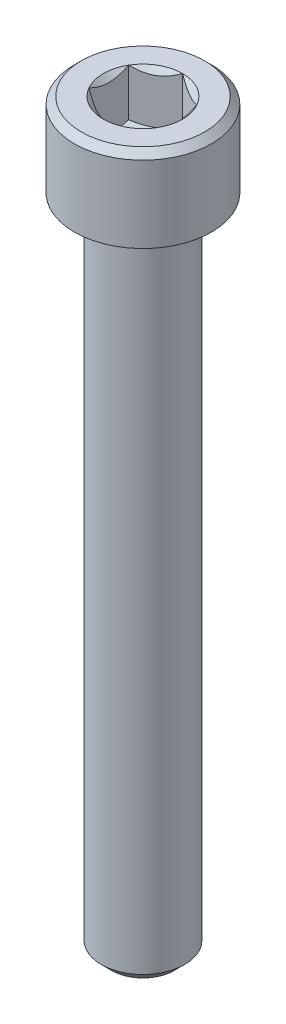
ISO-10303-21;
HEADER;
FILE_DESCRIPTION(('STEP AP214'),'2;1');
FILE_NAME('part.step','',(''),(''),'','','');
FILE_SCHEMA(('AUTOMOTIVE_DESIGN { 1 0 10303 214 1 1 1 1 }'));
ENDSEC;
DATA;
#1=APPLICATION_CONTEXT('core data for automotive mechanical design processes');
#2=APPLICATION_PROTOCOL_DEFINITION('international standard','automotive_design',2000,#1);
#3=PRODUCT_CONTEXT('',#1,'mechanical');
#4=PRODUCT('Part','Part','',(#3));
#5=PRODUCT_RELATED_PRODUCT_CATEGORY('part','',(#4));
#6=PRODUCT_DEFINITION_FORMATION('','',#4);
#7=PRODUCT_DEFINITION_CONTEXT('part definition',#1,'design');
#8=PRODUCT_DEFINITION('design','',#6,#7);
#9=PRODUCT_DEFINITION_SHAPE('','',#8);
#10=(LENGTH_UNIT() NAMED_UNIT(*) SI_UNIT(.MILLI.,.METRE.));
#11=(NAMED_UNIT(*) PLANE_ANGLE_UNIT() SI_UNIT($,.RADIAN.));
#12=(NAMED_UNIT(*) SI_UNIT($,.STERADIAN.) SOLID_ANGLE_UNIT());
#13=UNCERTAINTY_MEASURE_WITH_UNIT(LENGTH_MEASURE(1.E-05),#10,'distance_accuracy_value','');
#14=(GEOMETRIC_REPRESENTATION_CONTEXT(3) GLOBAL_UNCERTAINTY_ASSIGNED_CONTEXT((#13)) GLOBAL_UNIT_ASSIGNED_CONTEXT((#10,
#11,#12)) REPRESENTATION_CONTEXT('',''));
#15=CARTESIAN_POINT('',(0.,0.,0.));
#16=DIRECTION('',(0.,0.,1.));
#17=DIRECTION('',(1.,0.,0.));
#18=AXIS2_PLACEMENT_3D('',#15,#16,#17);
#19=CARTESIAN_POINT('',(0.,4.826,0.));
#20=DIRECTION('',(0.,1.,0.));
#21=DIRECTION('',(0.,0.,1.));
#22=AXIS2_PLACEMENT_3D('',#19,#20,#21);
#23=CONICAL_SURFACE('',#22,2.29135888084632,0.785398163397448);
#24=CARTESIAN_POINT('',(1.984575,4.82611547878185,1.14556397036933));
#25=CARTESIAN_POINT('',(1.9163590048332,4.78676285226392,1.18494849354192));
#26=CARTESIAN_POINT('',(1.84700231489304,4.74972131044619,1.22499159714897));
#27=CARTESIAN_POINT('',(1.70557619954781,4.68189885842333,1.30664400291398));
#28=CARTESIAN_POINT('',(1.63349332126322,4.65115568909176,1.34826107209555));
#29=CARTESIAN_POINT('',(1.488141602734,4.59849188881122,1.43217992591557));
#30=CARTESIAN_POINT('',(1.41490978751306,4.57643887587997,1.47446033414662));
#31=CARTESIAN_POINT('',(1.2668338174053,4.54246149294388,1.55995203534886));
#32=CARTESIAN_POINT('',(1.19199418724658,4.53051175609173,1.60316071596704));
#33=CARTESIAN_POINT('',(1.06301458545619,4.51973009908191,1.6776271237807));
#34=CARTESIAN_POINT('',(1.00904128422756,4.51813389905907,1.7087886237741));
#35=CARTESIAN_POINT('',(0.901182881480204,4.52082183886529,1.77106070163465));
#36=CARTESIAN_POINT('',(0.847297817514481,4.52510804034046,1.80217125782056));
#37=CARTESIAN_POINT('',(0.7400364617514,4.53931687301352,1.86409863044402));
#38=CARTESIAN_POINT('',(0.686660807239864,4.54924581045227,1.89491507894443));
#39=CARTESIAN_POINT('',(0.580832482591108,4.57419508427454,1.95601509066827));
#40=CARTESIAN_POINT('',(0.528379742028904,4.58921503038949,1.9862986945516));
#41=CARTESIAN_POINT('',(0.394017661036358,4.63380785163567,2.06387267818152));
#42=CARTESIAN_POINT('',(0.312941642841681,4.66674299593833,2.11068193911104));
#43=CARTESIAN_POINT('',(0.193726693270166,4.7223424412022,2.17951072233758));
#44=CARTESIAN_POINT('',(0.154440075614005,4.74187759205186,2.20219286161692));
#45=CARTESIAN_POINT('',(0.0765946381319537,4.7827287381194,2.24713694590236));
#46=CARTESIAN_POINT('',(0.0380353888983078,4.80404363956835,2.26939913882716));
#47=CARTESIAN_POINT('',(-0.000199999999994834,4.82611547878184,2.29147435090016));
#48=B_SPLINE_CURVE_WITH_KNOTS('',3,(#24,#25,#26,#27,#28,#29,#30,#31,#32,#33,#34,#35,#36,#37,#38,
#39,#40,#41,#42,#43,#44,#45,#46,#47),.UNSPECIFIED.,.F.,.F.,(4,2,2,2,2,2,2,2,2,2,2,4),(0.,
0.264339630306626,0.530219665093695,0.791876416371459,1.05287424418109,1.239639843932,
1.42647091743852,1.61351120244034,1.8005371524754,2.09764209964316,2.24579179873713,
2.39385111134156),.UNSPECIFIED.);
#49=CARTESIAN_POINT('',(1.984375,4.826,1.14567944042316));
#50=VERTEX_POINT('',#49);
#51=CARTESIAN_POINT('',(0.,4.826,2.29135888084632));
#52=VERTEX_POINT('',#51);
#53=EDGE_CURVE('E190',#50,#52,#48,.T.);
#54=ORIENTED_EDGE('',*,*,#53,.T.);
#55=CARTESIAN_POINT('',(0.,4.826,0.));
#56=DIRECTION('',(0.,1.,0.));
#57=DIRECTION('',(0.,0.,1.));
#58=AXIS2_PLACEMENT_3D('',#55,#56,#57);
#59=CIRCLE('',#58,2.29135888084632);
#60=EDGE_CURVE('E264',#52,#50,#59,.T.);
#61=ORIENTED_EDGE('',*,*,#60,.T.);
#62=EDGE_LOOP('',(#54,#61));
#63=FACE_BOUND('',#62,.T.);
#64=ADVANCED_FACE('F17',(#63),#23,.F.);
#65=CARTESIAN_POINT('',(-1.984375,4.826,1.14567944042317));
#66=VERTEX_POINT('',#65);
#67=EDGE_CURVE('E263',#66,#52,#59,.T.);
#68=ORIENTED_EDGE('',*,*,#67,.T.);
#69=CARTESIAN_POINT('',(0.00020000000000524,4.82611547878185,2.29147435090017));
#70=CARTESIAN_POINT('',(-0.0680159951667969,4.78676285226392,2.25208982772758));
#71=CARTESIAN_POINT('',(-0.13737268510696,4.74972131044619,2.21204672412052));
#72=CARTESIAN_POINT('',(-0.278798800452183,4.68189885842333,2.13039431835552));
#73=CARTESIAN_POINT('',(-0.350881678736779,4.65115568909176,2.08877724917394));
#74=CARTESIAN_POINT('',(-0.496233397266,4.59849188881122,2.00485839535392));
#75=CARTESIAN_POINT('',(-0.569465212486935,4.57643887587997,1.96257798712287));
#76=CARTESIAN_POINT('',(-0.717541182594703,4.54246149294388,1.87708628592063));
#77=CARTESIAN_POINT('',(-0.792380812753422,4.53051175609173,1.83387760530245));
#78=CARTESIAN_POINT('',(-0.921360414543812,4.51973009908191,1.75941119748879));
#79=CARTESIAN_POINT('',(-0.975333715772439,4.51813389905907,1.72824969749539));
#80=CARTESIAN_POINT('',(-1.0831921185198,4.52082183886529,1.66597761963484));
#81=CARTESIAN_POINT('',(-1.13707718248552,4.52510804034046,1.63486706344893));
#82=CARTESIAN_POINT('',(-1.2443385382486,4.53931687301352,1.57293969082547));
#83=CARTESIAN_POINT('',(-1.29771419276014,4.54924581045227,1.54212324232506));
#84=CARTESIAN_POINT('',(-1.40354251740889,4.57419508427454,1.48102323060122));
#85=CARTESIAN_POINT('',(-1.4559952579711,4.58921503038949,1.4507396267179));
#86=CARTESIAN_POINT('',(-1.59035733896364,4.63380785163567,1.37316564308797));
#87=CARTESIAN_POINT('',(-1.67143335715832,4.66674299593833,1.32635638215845));
#88=CARTESIAN_POINT('',(-1.79064830672984,4.7223424412022,1.25752759893191));
#89=CARTESIAN_POINT('',(-1.829934924386,4.74187759205186,1.23484545965257));
#90=CARTESIAN_POINT('',(-1.90778036186805,4.7827287381194,1.18990137536713));
#91=CARTESIAN_POINT('',(-1.9463396111017,4.80404363956835,1.16763918244233));
#92=CARTESIAN_POINT('',(-1.984575,4.82611547878184,1.14556397036933));
#93=B_SPLINE_CURVE_WITH_KNOTS('',3,(#69,#70,#71,#72,#73,#74,#75,#76,#77,#78,#79,#80,#81,#82,#83,
#84,#85,#86,#87,#88,#89,#90,#91,#92),.UNSPECIFIED.,.F.,.F.,(4,2,2,2,2,2,2,2,2,2,2,4),(0.,
0.264339630306629,0.530219665093698,0.791876416371465,1.0528742441811,1.23963984393201,
1.42647091743853,1.61351120244035,1.80053715247541,2.09764209964317,2.24579179873714,
2.39385111134158),.UNSPECIFIED.);
#94=EDGE_CURVE('E196',#52,#66,#93,.T.);
#95=ORIENTED_EDGE('',*,*,#94,.T.);
#96=EDGE_LOOP('',(#68,#95));
#97=FACE_BOUND('',#96,.T.);
#98=ADVANCED_FACE('F226',(#97),#23,.F.);
#99=CARTESIAN_POINT('',(1.984375,6.52130748324644,-3.45771088409132));
#100=CARTESIAN_POINT('',(1.984375,6.43262944586762,-3.35542683330867));
#101=CARTESIAN_POINT('',(1.984375,6.34446536162983,-3.25268780387356));
#102=CARTESIAN_POINT('',(1.984375,6.16953159373914,-3.04594702957406));
#103=CARTESIAN_POINT('',(1.984375,6.08276259352516,-2.94194470714936));
#104=CARTESIAN_POINT('',(1.984375,5.90909527980482,-2.73001070946145));
#105=CARTESIAN_POINT('',(1.984375,5.822239934163,-2.62204368545491));
#106=CARTESIAN_POINT('',(1.984375,5.65116778000237,-2.40407276272223));
#107=CARTESIAN_POINT('',(1.984375,5.56695031553371,-2.29406938136794));
#108=CARTESIAN_POINT('',(1.984375,5.402042566665,-2.07120370981882));
#109=CARTESIAN_POINT('',(1.984375,5.32135716597924,-1.95833778205997));
#110=CARTESIAN_POINT('',(1.984375,5.16517668266955,-1.72888861173673));
#111=CARTESIAN_POINT('',(1.984375,5.08968585678648,-1.61230243243413));
#112=CARTESIAN_POINT('',(1.984375,4.947134431062,-1.37524803754826));
#113=CARTESIAN_POINT('',(1.984375,4.8800132606332,-1.25481673054247));
#114=CARTESIAN_POINT('',(1.984375,4.75778822517673,-1.00801151762188));
#115=CARTESIAN_POINT('',(1.984375,4.70266224970091,-0.881649076411233));
#116=CARTESIAN_POINT('',(1.984375,4.63323107564838,-0.685684715970748));
#117=CARTESIAN_POINT('',(1.984375,4.61213776738587,-0.61849922209624));
#118=CARTESIAN_POINT('',(1.984375,4.57579445135076,-0.482546235656734));
#119=CARTESIAN_POINT('',(1.984375,4.56054351090578,-0.41377899746012));
#120=CARTESIAN_POINT('',(1.984375,4.53689825717652,-0.275490831109884));
#121=CARTESIAN_POINT('',(1.984375,4.52846218390903,-0.205977179571448));
#122=CARTESIAN_POINT('',(1.984375,4.51890880020465,-0.0664443832858304));
#123=CARTESIAN_POINT('',(1.984375,4.51779072084056,0.0035747075790733));
#124=CARTESIAN_POINT('',(1.984375,4.52296292884912,0.143424006703544));
#125=CARTESIAN_POINT('',(1.984375,4.52926289019542,0.213253849018881));
#126=CARTESIAN_POINT('',(1.984375,4.54881043261024,0.351927006353266));
#127=CARTESIAN_POINT('',(1.984375,4.56205938187111,0.420770124352072));
#128=CARTESIAN_POINT('',(1.984375,4.59475382728509,0.55745949001931));
#129=CARTESIAN_POINT('',(1.984375,4.61424263881878,0.625295193543097));
#130=CARTESIAN_POINT('',(1.984375,4.6583635263663,0.759246417792874));
#131=CARTESIAN_POINT('',(1.984375,4.68299565938668,0.825361919443687));
#132=CARTESIAN_POINT('',(1.984375,4.74245510304685,0.970580741117793));
#133=CARTESIAN_POINT('',(1.984375,4.77832893658829,1.04925193970017));
#134=CARTESIAN_POINT('',(1.984375,4.85486121641692,1.20425175336704));
#135=CARTESIAN_POINT('',(1.984375,4.89552242697314,1.28057898264071));
#136=CARTESIAN_POINT('',(1.984375,4.98056622739607,1.43132281685668));
#137=CARTESIAN_POINT('',(1.984375,5.02495635189839,1.50573513623634));
#138=CARTESIAN_POINT('',(1.984375,5.1165292817791,1.65278836739454));
#139=CARTESIAN_POINT('',(1.984375,5.16371153170412,1.72542962746702));
#140=CARTESIAN_POINT('',(1.984375,5.26051114971045,1.86962401155094));
#141=CARTESIAN_POINT('',(1.984375,5.31014010813647,1.9411693187575));
#142=CARTESIAN_POINT('',(1.984375,5.41114100200018,2.08302186505396));
#143=CARTESIAN_POINT('',(1.984375,5.46251306880154,2.1533290102246));
#144=CARTESIAN_POINT('',(1.984375,5.61857454823435,2.36253483271691));
#145=CARTESIAN_POINT('',(1.984375,5.72532842618644,2.49989159715618));
#146=CARTESIAN_POINT('',(1.984375,5.94598591328433,2.77607806575545));
#147=CARTESIAN_POINT('',(1.984375,6.06000910834152,2.91481128320863));
#148=CARTESIAN_POINT('',(1.984375,6.23243856402619,3.12046871280676));
#149=CARTESIAN_POINT('',(1.984375,6.28982890842778,3.1882488408292));
#150=CARTESIAN_POINT('',(1.984375,6.40517040906205,3.32332427251419));
#151=CARTESIAN_POINT('',(1.984375,6.46312153554217,3.39061960157108));
#152=CARTESIAN_POINT('',(1.984375,6.52130748324643,3.45771088409131));
#153=B_SPLINE_CURVE_WITH_KNOTS('',3,(#99,#100,#101,#102,#103,#104,#105,#106,#107,#108,#109,#110,
#111,#112,#113,#114,#115,#116,#117,#118,#119,#120,#121,#122,#123,#124,#125,#126,#127,#128,#129,
#130,#131,#132,#133,#134,#135,#136,#137,#138,#139,#140,#141,#142,#143,#144,#145,#146,#147,#148,
#149,#150,#151,#152),.UNSPECIFIED.,.F.,.F.,(4,2,2,2,2,2,2,2,2,2,2,2,2,2,2,2,2,2,2,2,2,2,2,2,2,2,
4),(0.,0.406127590682087,0.812448423474263,1.2281189762356,1.64368533200276,2.05980921904513,
2.47627013871692,2.88951664651822,3.30199485039354,3.51304063418481,3.72405271268915,
3.93376173343452,4.14344871896586,4.35340946345541,4.5634115628274,4.77490424990243,
4.98639928120368,5.24557242311816,5.50489595439299,5.76475669481382,6.02456591232051,
6.28575340350717,6.54696062214586,7.06874360549045,7.6074336441421,7.87387094807471,
8.1402941927268),.UNSPECIFIED.);
#154=CARTESIAN_POINT('',(1.984375,4.826,-1.14567944042317));
#155=VERTEX_POINT('',#154);
#156=EDGE_CURVE('E125',#155,#50,#153,.T.);
#157=ORIENTED_EDGE('',*,*,#156,.T.);
#158=EDGE_CURVE('E261',#50,#155,#59,.T.);
#159=ORIENTED_EDGE('',*,*,#158,.T.);
#160=EDGE_LOOP('',(#157,#159));
#161=FACE_BOUND('',#160,.T.);
#162=ADVANCED_FACE('F231',(#161),#23,.F.);
#163=CARTESIAN_POINT('',(-1.984375,4.826,-1.14567944042317));
#164=VERTEX_POINT('',#163);
#165=EDGE_CURVE('E259',#164,#66,#59,.T.);
#166=ORIENTED_EDGE('',*,*,#165,.T.);
#167=CARTESIAN_POINT('',(-1.984375,6.52130748324645,3.45771088409133));
#168=CARTESIAN_POINT('',(-1.984375,6.43262944586763,3.35542683330868));
#169=CARTESIAN_POINT('',(-1.984375,6.34446536162984,3.25268780387358));
#170=CARTESIAN_POINT('',(-1.984375,6.16953159373915,3.04594702957407));
#171=CARTESIAN_POINT('',(-1.984375,6.08276259352517,2.94194470714937));
#172=CARTESIAN_POINT('',(-1.984375,5.90909527980482,2.73001070946146));
#173=CARTESIAN_POINT('',(-1.984375,5.822239934163,2.62204368545492));
#174=CARTESIAN_POINT('',(-1.984375,5.65116778000238,2.40407276272224));
#175=CARTESIAN_POINT('',(-1.984375,5.56695031553372,2.29406938136795));
#176=CARTESIAN_POINT('',(-1.984375,5.40204256666501,2.07120370981883));
#177=CARTESIAN_POINT('',(-1.984375,5.32135716597925,1.95833778205998));
#178=CARTESIAN_POINT('',(-1.984375,5.16517668266955,1.72888861173674));
#179=CARTESIAN_POINT('',(-1.984375,5.08968585678649,1.61230243243414));
#180=CARTESIAN_POINT('',(-1.984375,4.947134431062,1.37524803754827));
#181=CARTESIAN_POINT('',(-1.984375,4.88001326063321,1.25481673054247));
#182=CARTESIAN_POINT('',(-1.984375,4.75778822517673,1.00801151762188));
#183=CARTESIAN_POINT('',(-1.984375,4.70266224970091,0.88164907641124));
#184=CARTESIAN_POINT('',(-1.984375,4.63323107564838,0.685684715970755));
#185=CARTESIAN_POINT('',(-1.984375,4.61213776738587,0.618499222096247));
#186=CARTESIAN_POINT('',(-1.984375,4.57579445135076,0.48254623565674));
#187=CARTESIAN_POINT('',(-1.984375,4.56054351090578,0.413778997460125));
#188=CARTESIAN_POINT('',(-1.984375,4.53689825717652,0.27549083110989));
#189=CARTESIAN_POINT('',(-1.984375,4.52846218390903,0.205977179571453));
#190=CARTESIAN_POINT('',(-1.984375,4.51890880020465,0.066444383285835));
#191=CARTESIAN_POINT('',(-1.984375,4.51779072084056,-0.00357470757906875));
#192=CARTESIAN_POINT('',(-1.984375,4.52296292884912,-0.14342400670354));
#193=CARTESIAN_POINT('',(-1.984375,4.52926289019542,-0.213253849018878));
#194=CARTESIAN_POINT('',(-1.984375,4.54881043261024,-0.351927006353263));
#195=CARTESIAN_POINT('',(-1.984375,4.56205938187111,-0.420770124352069));
#196=CARTESIAN_POINT('',(-1.984375,4.59475382728509,-0.557459490019307));
#197=CARTESIAN_POINT('',(-1.984375,4.61424263881878,-0.625295193543094));
#198=CARTESIAN_POINT('',(-1.984375,4.6583635263663,-0.759246417792872));
#199=CARTESIAN_POINT('',(-1.984375,4.68299565938668,-0.825361919443686));
#200=CARTESIAN_POINT('',(-1.984375,4.74245510304685,-0.970580741117792));
#201=CARTESIAN_POINT('',(-1.984375,4.77832893658829,-1.04925193970017));
#202=CARTESIAN_POINT('',(-1.984375,4.85486121641692,-1.20425175336703));
#203=CARTESIAN_POINT('',(-1.984375,4.89552242697314,-1.28057898264071));
#204=CARTESIAN_POINT('',(-1.984375,4.98056622739607,-1.43132281685667));
#205=CARTESIAN_POINT('',(-1.984375,5.02495635189838,-1.50573513623633));
#206=CARTESIAN_POINT('',(-1.984375,5.1165292817791,-1.65278836739453));
#207=CARTESIAN_POINT('',(-1.984375,5.16371153170412,-1.72542962746701));
#208=CARTESIAN_POINT('',(-1.984375,5.26051114971045,-1.86962401155093));
#209=CARTESIAN_POINT('',(-1.984375,5.31014010813646,-1.9411693187575));
#210=CARTESIAN_POINT('',(-1.984375,5.41114100200017,-2.08302186505395));
#211=CARTESIAN_POINT('',(-1.984375,5.46251306880154,-2.15332901022459));
#212=CARTESIAN_POINT('',(-1.984375,5.61857454823435,-2.3625348327169));
#213=CARTESIAN_POINT('',(-1.984375,5.72532842618643,-2.49989159715618));
#214=CARTESIAN_POINT('',(-1.984375,5.94598591328432,-2.77607806575545));
#215=CARTESIAN_POINT('',(-1.984375,6.06000910834152,-2.91481128320863));
#216=CARTESIAN_POINT('',(-1.984375,6.2324385640262,-3.12046871280677));
#217=CARTESIAN_POINT('',(-1.984375,6.2898289084278,-3.18824884082921));
#218=CARTESIAN_POINT('',(-1.984375,6.40517040906206,-3.32332427251421));
#219=CARTESIAN_POINT('',(-1.984375,6.46312153554218,-3.3906196015711));
#220=CARTESIAN_POINT('',(-1.984375,6.52130748324645,-3.45771088409133));
#221=B_SPLINE_CURVE_WITH_KNOTS('',3,(#167,#168,#169,#170,#171,#172,#173,#174,#175,#176,#177,
#178,#179,#180,#181,#182,#183,#184,#185,#186,#187,#188,#189,#190,#191,#192,#193,#194,#195,#196,
#197,#198,#199,#200,#201,#202,#203,#204,#205,#206,#207,#208,#209,#210,#211,#212,#213,#214,#215,
#216,#217,#218,#219,#220),.UNSPECIFIED.,.F.,.F.,(4,2,2,2,2,2,2,2,2,2,2,2,2,2,2,2,2,2,2,2,2,2,2,
2,2,2,4),(0.,0.406127590682087,0.812448423474265,1.22811897623561,1.64368533200276,
2.05980921904514,2.47627013871693,2.88951664651823,3.30199485039355,3.51304063418482,
3.72405271268916,3.93376173343454,4.14344871896587,4.35340946345543,4.56341156282741,
4.77490424990244,4.9863992812037,5.24557242311817,5.504895954393,5.76475669481384,
6.02456591232052,6.28575340350718,6.54696062214588,7.06874360549046,7.60743364414213,
7.87387094807475,8.14029419272685),.UNSPECIFIED.);
#222=EDGE_CURVE('E206',#66,#164,#221,.T.);
#223=ORIENTED_EDGE('',*,*,#222,.T.);
#224=EDGE_LOOP('',(#166,#223));
#225=FACE_BOUND('',#224,.T.);
#226=ADVANCED_FACE('F244',(#225),#23,.F.);
#227=CARTESIAN_POINT('',(0.,4.826,-2.29135888084632));
#228=VERTEX_POINT('',#227);
#229=EDGE_CURVE('E255',#228,#164,#59,.T.);
#230=ORIENTED_EDGE('',*,*,#229,.T.);
#231=CARTESIAN_POINT('',(-1.984575,4.82611547878184,-1.14556397036933));
#232=CARTESIAN_POINT('',(-1.9163590048332,4.78676285226391,-1.18494849354192));
#233=CARTESIAN_POINT('',(-1.84700231489303,4.74972131044619,-1.22499159714897));
#234=CARTESIAN_POINT('',(-1.70557619954781,4.68189885842332,-1.30664400291398));
#235=CARTESIAN_POINT('',(-1.63349332126322,4.65115568909175,-1.34826107209555));
#236=CARTESIAN_POINT('',(-1.48814160273399,4.59849188881121,-1.43217992591557));
#237=CARTESIAN_POINT('',(-1.41490978751306,4.57643887587997,-1.47446033414663));
#238=CARTESIAN_POINT('',(-1.26683381740529,4.54246149294388,-1.55995203534886));
#239=CARTESIAN_POINT('',(-1.19199418724657,4.53051175609173,-1.60316071596704));
#240=CARTESIAN_POINT('',(-1.06301458545618,4.51973009908191,-1.6776271237807));
#241=CARTESIAN_POINT('',(-1.00904128422756,4.51813389905907,-1.7087886237741));
#242=CARTESIAN_POINT('',(-0.901182881480201,4.52082183886529,-1.77106070163465));
#243=CARTESIAN_POINT('',(-0.847297817514478,4.52510804034046,-1.80217125782056));
#244=CARTESIAN_POINT('',(-0.740036461751397,4.53931687301352,-1.86409863044402));
#245=CARTESIAN_POINT('',(-0.686660807239861,4.54924581045227,-1.89491507894443));
#246=CARTESIAN_POINT('',(-0.580832482591105,4.57419508427454,-1.95601509066827));
#247=CARTESIAN_POINT('',(-0.528379742028901,4.58921503038949,-1.9862986945516));
#248=CARTESIAN_POINT('',(-0.394017661036355,4.63380785163567,-2.06387267818152));
#249=CARTESIAN_POINT('',(-0.312941642841679,4.66674299593833,-2.11068193911104));
#250=CARTESIAN_POINT('',(-0.193726693270165,4.7223424412022,-2.17951072233758));
#251=CARTESIAN_POINT('',(-0.154440075614004,4.74187759205186,-2.20219286161691));
#252=CARTESIAN_POINT('',(-0.0765946381319538,4.7827287381194,-2.24713694590236));
#253=CARTESIAN_POINT('',(-0.0380353888983086,4.80404363956835,-2.26939913882716));
#254=CARTESIAN_POINT('',(0.000199999999992909,4.82611547878184,-2.29147435090016));
#255=B_SPLINE_CURVE_WITH_KNOTS('',3,(#231,#232,#233,#234,#235,#236,#237,#238,#239,#240,#241,
#242,#243,#244,#245,#246,#247,#248,#249,#250,#251,#252,#253,#254),.UNSPECIFIED.,.F.,.F.,(4,2,2,
2,2,2,2,2,2,2,2,4),(0.,0.264339630306626,0.530219665093693,0.791876416371458,1.05287424418109,
1.239639843932,1.42647091743852,1.61351120244034,1.8005371524754,2.09764209964315,
2.24579179873712,2.39385111134156),.UNSPECIFIED.);
#256=EDGE_CURVE('E96',#164,#228,#255,.T.);
#257=ORIENTED_EDGE('',*,*,#256,.T.);
#258=EDGE_LOOP('',(#230,#257));
#259=FACE_BOUND('',#258,.T.);
#260=ADVANCED_FACE('F235',(#259),#23,.F.);
#261=CARTESIAN_POINT('',(0.,-18.6936663954414,0.));
#262=DIRECTION('',(0.,1.,0.));
#263=DIRECTION('',(0.,0.,1.));
#264=AXIS2_PLACEMENT_3D('',#261,#262,#263);
#265=CYLINDRICAL_SURFACE('',#264,3.96875);
#266=CARTESIAN_POINT('',(0.,4.429125,0.));
#267=DIRECTION('',(0.,1.,0.));
#268=DIRECTION('',(0.,0.,1.));
#269=AXIS2_PLACEMENT_3D('',#266,#267,#268);
#270=CIRCLE('',#269,3.96875);
#271=CARTESIAN_POINT('',(0.,4.429125,3.96875));
#272=VERTEX_POINT('',#271);
#273=EDGE_CURVE('E212',#272,#272,#270,.T.);
#274=ORIENTED_EDGE('',*,*,#273,.F.);
#275=EDGE_LOOP('',(#274));
#276=FACE_BOUND('',#275,.T.);
#277=CARTESIAN_POINT('',(0.,0.,0.));
#278=DIRECTION('',(0.,1.,0.));
#279=DIRECTION('',(0.,0.,1.));
#280=AXIS2_PLACEMENT_3D('',#277,#278,#279);
#281=CIRCLE('',#280,3.96875);
#282=CARTESIAN_POINT('',(0.,0.,3.96875));
#283=VERTEX_POINT('',#282);
#284=EDGE_CURVE('E11',#283,#283,#281,.T.);
#285=ORIENTED_EDGE('',*,*,#284,.T.);
#286=EDGE_LOOP('',(#285));
#287=FACE_BOUND('',#286,.T.);
#288=ADVANCED_FACE('F19',(#276,#287),#265,.T.);
#289=CARTESIAN_POINT('',(0.,0.,3.254375));
#290=DIRECTION('',(0.,1.,0.));
#291=DIRECTION('',(0.,0.,1.));
#292=AXIS2_PLACEMENT_3D('',#289,#290,#291);
#293=PLANE('',#292);
#294=ORIENTED_EDGE('',*,*,#284,.F.);
#295=EDGE_LOOP('',(#294));
#296=FACE_BOUND('',#295,.T.);
#297=CARTESIAN_POINT('',(0.,0.,0.));
#298=DIRECTION('',(0.,1.,0.));
#299=DIRECTION('',(0.,0.,1.));
#300=AXIS2_PLACEMENT_3D('',#297,#298,#299);
#301=CIRCLE('',#300,2.54);
#302=CARTESIAN_POINT('',(0.,0.,2.54));
#303=VERTEX_POINT('',#302);
#304=EDGE_CURVE('E25',#303,#303,#301,.T.);
#305=ORIENTED_EDGE('',*,*,#304,.T.);
#306=EDGE_LOOP('',(#305));
#307=FACE_BOUND('',#306,.T.);
#308=ADVANCED_FACE('F250',(#296,#307),#293,.F.);
#309=CARTESIAN_POINT('',(0.,-0.127,0.));
#310=DIRECTION('',(0.,1.,0.));
#311=DIRECTION('',(0.,0.,1.));
#312=AXIS2_PLACEMENT_3D('',#309,#310,#311);
#313=TOROIDAL_SURFACE('',#312,2.54,0.127);
#314=ORIENTED_EDGE('',*,*,#304,.F.);
#315=EDGE_LOOP('',(#314));
#316=FACE_BOUND('',#315,.T.);
#317=CARTESIAN_POINT('',(0.,-0.127000000000002,0.));
#318=DIRECTION('',(0.,1.,0.));
#319=DIRECTION('',(0.,0.,1.));
#320=AXIS2_PLACEMENT_3D('',#317,#318,#319);
#321=CIRCLE('',#320,2.413);
#322=CARTESIAN_POINT('',(0.,-0.127000000000002,2.413));
#323=VERTEX_POINT('',#322);
#324=EDGE_CURVE('E274',#323,#323,#321,.T.);
#325=ORIENTED_EDGE('',*,*,#324,.T.);
#326=EDGE_LOOP('',(#325));
#327=FACE_BOUND('',#326,.T.);
#328=ADVANCED_FACE('F280',(#316,#327),#313,.F.);
#329=CARTESIAN_POINT('',(0.,-18.6936663954414,0.));
#330=DIRECTION('',(0.,1.,0.));
#331=DIRECTION('',(0.,0.,1.));
#332=AXIS2_PLACEMENT_3D('',#329,#330,#331);
#333=CYLINDRICAL_SURFACE('',#332,2.413);
#334=ORIENTED_EDGE('',*,*,#324,.F.);
#335=EDGE_LOOP('',(#334));
#336=FACE_BOUND('',#335,.T.);
#337=CARTESIAN_POINT('',(0.,-37.5031,0.));
#338=DIRECTION('',(0.,1.,0.));
#339=DIRECTION('',(0.,0.,1.));
#340=AXIS2_PLACEMENT_3D('',#337,#338,#339);
#341=CIRCLE('',#340,2.413);
#342=CARTESIAN_POINT('',(0.,-37.5031,2.413));
#343=VERTEX_POINT('',#342);
#344=EDGE_CURVE('E271',#343,#343,#341,.T.);
#345=ORIENTED_EDGE('',*,*,#344,.T.);
#346=EDGE_LOOP('',(#345));
#347=FACE_BOUND('',#346,.T.);
#348=ADVANCED_FACE('F283',(#336,#347),#333,.T.);
#349=CARTESIAN_POINT('',(0.,-38.1,0.));
#350=DIRECTION('',(0.,1.,0.));
#351=DIRECTION('',(0.,0.,1.));
#352=AXIS2_PLACEMENT_3D('',#349,#350,#351);
#353=CONICAL_SURFACE('',#352,1.8161,0.78539816339745);
#354=ORIENTED_EDGE('',*,*,#344,.F.);
#355=EDGE_LOOP('',(#354));
#356=FACE_BOUND('',#355,.T.);
#357=CARTESIAN_POINT('',(0.,-38.1,0.));
#358=DIRECTION('',(0.,1.,0.));
#359=DIRECTION('',(0.,0.,1.));
#360=AXIS2_PLACEMENT_3D('',#357,#358,#359);
#361=CIRCLE('',#360,1.8161);
#362=CARTESIAN_POINT('',(0.,-38.1,1.8161));
#363=VERTEX_POINT('',#362);
#364=EDGE_CURVE('E267',#363,#363,#361,.T.);
#365=ORIENTED_EDGE('',*,*,#364,.T.);
#366=EDGE_LOOP('',(#365));
#367=FACE_BOUND('',#366,.T.);
#368=ADVANCED_FACE('F241',(#356,#367),#353,.T.);
#369=CARTESIAN_POINT('',(0.,-38.1,0.90805));
#370=DIRECTION('',(0.,1.,0.));
#371=DIRECTION('',(0.,0.,1.));
#372=AXIS2_PLACEMENT_3D('',#369,#370,#371);
#373=PLANE('',#372);
#374=ORIENTED_EDGE('',*,*,#364,.F.);
#375=EDGE_LOOP('',(#374));
#376=FACE_BOUND('',#375,.T.);
#377=ADVANCED_FACE('F158',(#376),#373,.F.);
#378=EDGE_CURVE('E258',#155,#228,#59,.T.);
#379=ORIENTED_EDGE('',*,*,#378,.T.);
#380=CARTESIAN_POINT('',(-0.000200000000007013,4.82611547878185,-2.29147435090017));
#381=CARTESIAN_POINT('',(0.0680159951667952,4.78676285226392,-2.25208982772758));
#382=CARTESIAN_POINT('',(0.137372685106959,4.74972131044619,-2.21204672412052));
#383=CARTESIAN_POINT('',(0.278798800452182,4.68189885842333,-2.13039431835551));
#384=CARTESIAN_POINT('',(0.350881678736778,4.65115568909176,-2.08877724917394));
#385=CARTESIAN_POINT('',(0.496233397266,4.59849188881122,-2.00485839535392));
#386=CARTESIAN_POINT('',(0.569465212486934,4.57643887587997,-1.96257798712287));
#387=CARTESIAN_POINT('',(0.717541182594703,4.54246149294388,-1.87708628592063));
#388=CARTESIAN_POINT('',(0.792380812753422,4.53051175609173,-1.83387760530245));
#389=CARTESIAN_POINT('',(0.921360414543813,4.51973009908191,-1.75941119748879));
#390=CARTESIAN_POINT('',(0.975333715772439,4.51813389905907,-1.72824969749539));
#391=CARTESIAN_POINT('',(1.0831921185198,4.52082183886529,-1.66597761963484));
#392=CARTESIAN_POINT('',(1.13707718248552,4.52510804034046,-1.63486706344893));
#393=CARTESIAN_POINT('',(1.2443385382486,4.53931687301352,-1.57293969082547));
#394=CARTESIAN_POINT('',(1.29771419276014,4.54924581045227,-1.54212324232506));
#395=CARTESIAN_POINT('',(1.40354251740889,4.57419508427454,-1.48102323060122));
#396=CARTESIAN_POINT('',(1.4559952579711,4.58921503038949,-1.45073962671789));
#397=CARTESIAN_POINT('',(1.59035733896364,4.63380785163567,-1.37316564308797));
#398=CARTESIAN_POINT('',(1.67143335715832,4.66674299593833,-1.32635638215845));
#399=CARTESIAN_POINT('',(1.79064830672984,4.7223424412022,-1.25752759893191));
#400=CARTESIAN_POINT('',(1.829934924386,4.74187759205186,-1.23484545965257));
#401=CARTESIAN_POINT('',(1.90778036186805,4.7827287381194,-1.18990137536713));
#402=CARTESIAN_POINT('',(1.9463396111017,4.80404363956835,-1.16763918244233));
#403=CARTESIAN_POINT('',(1.984575,4.82611547878184,-1.14556397036933));
#404=B_SPLINE_CURVE_WITH_KNOTS('',3,(#380,#381,#382,#383,#384,#385,#386,#387,#388,#389,#390,
#391,#392,#393,#394,#395,#396,#397,#398,#399,#400,#401,#402,#403),.UNSPECIFIED.,.F.,.F.,(4,2,2,
2,2,2,2,2,2,2,2,4),(0.,0.264339630306629,0.530219665093699,0.791876416371466,1.0528742441811,
1.23963984393201,1.42647091743853,1.61351120244035,1.80053715247541,2.09764209964317,
2.24579179873714,2.39385111134158),.UNSPECIFIED.);
#405=EDGE_CURVE('E31',#228,#155,#404,.T.);
#406=ORIENTED_EDGE('',*,*,#405,.T.);
#407=EDGE_LOOP('',(#379,#406));
#408=FACE_BOUND('',#407,.T.);
#409=ADVANCED_FACE('F132',(#408),#23,.F.);
#410=CARTESIAN_POINT('',(0.,4.826,2.93161694042316));
#411=DIRECTION('',(0.,1.,0.));
#412=DIRECTION('',(0.,0.,1.));
#413=AXIS2_PLACEMENT_3D('',#410,#411,#412);
#414=PLANE('',#413);
#415=CARTESIAN_POINT('',(0.,4.826,0.));
#416=DIRECTION('',(0.,1.,0.));
#417=DIRECTION('',(0.,0.,1.));
#418=AXIS2_PLACEMENT_3D('',#415,#416,#417);
#419=CIRCLE('',#418,3.571875);
#420=CARTESIAN_POINT('',(0.,4.826,3.571875));
#421=VERTEX_POINT('',#420);
#422=EDGE_CURVE('E268',#421,#421,#419,.T.);
#423=ORIENTED_EDGE('',*,*,#422,.T.);
#424=EDGE_LOOP('',(#423));
#425=FACE_BOUND('',#424,.T.);
#426=ORIENTED_EDGE('',*,*,#60,.F.);
#427=ORIENTED_EDGE('',*,*,#67,.F.);
#428=ORIENTED_EDGE('',*,*,#165,.F.);
#429=ORIENTED_EDGE('',*,*,#229,.F.);
#430=ORIENTED_EDGE('',*,*,#378,.F.);
#431=ORIENTED_EDGE('',*,*,#158,.F.);
#432=EDGE_LOOP('',(#426,#427,#428,#429,#430,#431));
#433=FACE_BOUND('',#432,.T.);
#434=ADVANCED_FACE('F234',(#425,#433),#414,.T.);
#435=CARTESIAN_POINT('',(0.,4.429125,0.));
#436=DIRECTION('',(0.,-1.,0.));
#437=DIRECTION('',(0.,0.,-1.));
#438=AXIS2_PLACEMENT_3D('',#435,#436,#437);
#439=CONICAL_SURFACE('',#438,3.96875,0.78539816339745);
#440=ORIENTED_EDGE('',*,*,#422,.F.);
#441=EDGE_LOOP('',(#440));
#442=FACE_BOUND('',#441,.T.);
#443=ORIENTED_EDGE('',*,*,#273,.T.);
#444=EDGE_LOOP('',(#443));
#445=FACE_BOUND('',#444,.T.);
#446=ADVANCED_FACE('F143',(#442,#445),#439,.T.);
#447=CARTESIAN_POINT('',(-1.984375,-1.1106512134823,0.));
#448=DIRECTION('',(-1.,0.,0.));
#449=DIRECTION('',(0.,0.,1.));
#450=AXIS2_PLACEMENT_3D('',#447,#448,#449);
#451=PLANE('',#450);
#452=ORIENTED_EDGE('',*,*,#222,.F.);
#453=DIRECTION('',(0.,1.,0.));
#454=VECTOR('',#453,1.);
#455=CARTESIAN_POINT('',(-1.984375,-1.1106512134823,1.14567944042317));
#456=LINE('',#455,#454);
#457=CARTESIAN_POINT('',(-1.984375,2.08945452467681,1.14567944042317));
#458=VERTEX_POINT('',#457);
#459=EDGE_CURVE('E80',#458,#66,#456,.T.);
#460=ORIENTED_EDGE('',*,*,#459,.F.);
#461=CARTESIAN_POINT('',(-1.984375,4.42690590287542,-5.85436456510873));
#462=CARTESIAN_POINT('',(-1.984375,4.35588977333528,-5.7295632914009));
#463=CARTESIAN_POINT('',(-1.984375,4.28504525904714,-5.60466411462751));
#464=CARTESIAN_POINT('',(-1.984375,4.14378184169921,-5.35462320385655));
#465=CARTESIAN_POINT('',(-1.984375,4.07336294423939,-5.22948146669602));
#466=CARTESIAN_POINT('',(-1.984375,3.86279955126345,-4.85349954828695));
#467=CARTESIAN_POINT('',(-1.984375,3.72342088659338,-4.60222973342794));
#468=CARTESIAN_POINT('',(-1.984375,3.44532150214495,-4.09354827294376));
#469=CARTESIAN_POINT('',(-1.984375,3.30665564054008,-3.83610641521805));
#470=CARTESIAN_POINT('',(-1.984375,3.1026760457673,-3.4478641870196));
#471=CARTESIAN_POINT('',(-1.984375,3.03535982886417,-3.31811778611126));
#472=CARTESIAN_POINT('',(-1.984375,2.90252103290933,-3.05771181575714));
#473=CARTESIAN_POINT('',(-1.984375,2.83699840326312,-2.92705227220056));
#474=CARTESIAN_POINT('',(-1.984375,2.70251106828089,-2.65258581347795));
#475=CARTESIAN_POINT('',(-1.984375,2.63377654243134,-2.50866550174565));
#476=CARTESIAN_POINT('',(-1.984375,2.50041004150475,-2.21887100441734));
#477=CARTESIAN_POINT('',(-1.984375,2.43577916207758,-2.07299630949728));
#478=CARTESIAN_POINT('',(-1.984375,2.31278760505755,-1.77909828864268));
#479=CARTESIAN_POINT('',(-1.984375,2.25440918103385,-1.63108247464689));
#480=CARTESIAN_POINT('',(-1.984375,2.14680535241344,-1.33172418244179));
#481=CARTESIAN_POINT('',(-1.984375,2.09757584845007,-1.18038322828851));
#482=CARTESIAN_POINT('',(-1.984375,2.02659350968816,-0.923330403581485));
#483=CARTESIAN_POINT('',(-1.984375,2.00110150498184,-0.818666325060485));
#484=CARTESIAN_POINT('',(-1.984375,1.95822925638616,-0.607678025855774));
#485=CARTESIAN_POINT('',(-1.984375,1.94084644098805,-0.501354342518225));
#486=CARTESIAN_POINT('',(-1.984375,1.91589057691193,-0.288238830241303));
#487=CARTESIAN_POINT('',(-1.984375,1.90825325724032,-0.181454778048271));
#488=CARTESIAN_POINT('',(-1.984375,1.90342915050395,0.0323480596777573));
#489=CARTESIAN_POINT('',(-1.984375,1.9062418379514,0.139366833137127));
#490=CARTESIAN_POINT('',(-1.984375,1.92376727381035,0.376366051555176));
#491=CARTESIAN_POINT('',(-1.984375,1.94098769581022,0.50615932510805));
#492=CARTESIAN_POINT('',(-1.984375,1.98805756970463,0.763434105332206));
#493=CARTESIAN_POINT('',(-1.984375,2.01791766687064,0.8909135686896));
#494=CARTESIAN_POINT('',(-1.984375,2.08778292156683,1.14586487289779));
#495=CARTESIAN_POINT('',(-1.984375,2.12798732256046,1.27328071713379));
#496=CARTESIAN_POINT('',(-1.984375,2.19352840838852,1.46252740118767));
#497=CARTESIAN_POINT('',(-1.984375,2.2162461419508,1.52529261118087));
#498=CARTESIAN_POINT('',(-1.984375,2.26316080249081,1.65026823952602));
#499=CARTESIAN_POINT('',(-1.984375,2.28735770562137,1.71247866680365));
#500=CARTESIAN_POINT('',(-1.984375,2.3494998494132,1.86763713423447));
#501=CARTESIAN_POINT('',(-1.984375,2.38822677604846,1.96027125624634));
#502=CARTESIAN_POINT('',(-1.984375,2.46785672721174,2.14460225768426));
#503=CARTESIAN_POINT('',(-1.984375,2.50875993722951,2.23629905642345));
#504=CARTESIAN_POINT('',(-1.984375,2.63402283493443,2.51028267483398));
#505=CARTESIAN_POINT('',(-1.984375,2.7209139442596,2.69140985357735));
#506=CARTESIAN_POINT('',(-1.984375,2.89906871634569,3.05178783835767));
#507=CARTESIAN_POINT('',(-1.984375,2.99033832092699,3.23103566791592));
#508=CARTESIAN_POINT('',(-1.984375,3.17574141958964,3.58805097493485));
#509=CARTESIAN_POINT('',(-1.984375,3.26987505156938,3.7658183805889));
#510=CARTESIAN_POINT('',(-1.984375,3.45131637099216,4.10386455026829));
#511=CARTESIAN_POINT('',(-1.984375,3.538448575724,4.26423787944478));
#512=CARTESIAN_POINT('',(-1.984375,3.71393414109542,4.58432496888202));
#513=CARTESIAN_POINT('',(-1.984375,3.80228756396531,4.74403869498838));
#514=CARTESIAN_POINT('',(-1.984375,3.9796191344674,5.06242098987328));
#515=CARTESIAN_POINT('',(-1.984375,4.06859421819799,5.22109126791615));
#516=CARTESIAN_POINT('',(-1.984375,4.24725992927077,5.53801313064387));
#517=CARTESIAN_POINT('',(-1.984375,4.33695050303506,5.69626474551931));
#518=CARTESIAN_POINT('',(-1.984375,4.42690590287542,5.85436456510873));
#519=B_SPLINE_CURVE_WITH_KNOTS('',3,(#461,#462,#463,#464,#465,#466,#467,#468,#469,#470,#471,
#472,#473,#474,#475,#476,#477,#478,#479,#480,#481,#482,#483,#484,#485,#486,#487,#488,#489,#490,
#491,#492,#493,#494,#495,#496,#497,#498,#499,#500,#501,#502,#503,#504,#505,#506,#507,#508,#509,
#510,#511,#512,#513,#514,#515,#516,#517,#518),.UNSPECIFIED.,.F.,.F.,(4,2,2,2,2,2,2,2,2,2,2,2,2,
2,2,2,2,2,2,2,2,2,2,2,2,2,2,2,4),(0.,0.43077598014733,0.86155761585606,1.7235598234942,
2.60074943761128,3.03924870835695,3.47773559690274,3.95616691296619,4.43472543488823,
4.91188749900691,5.38883524237575,5.71175873233177,6.0345797501453,6.35526058812353,
6.67592530060242,7.06791248496861,7.46023046411401,7.86075912977084,8.06099644755658,
8.26123053796692,8.56240284285517,8.86360085861743,9.46616836322798,10.0695780837202,
10.6730169035567,11.2205550033425,11.7681211079588,12.3138620910025,12.8595625840278),.UNSPECIFIED.);
#520=CARTESIAN_POINT('',(-1.984375,2.08945452467681,-1.14567944042317));
#521=VERTEX_POINT('',#520);
#522=EDGE_CURVE('E72',#521,#458,#519,.T.);
#523=ORIENTED_EDGE('',*,*,#522,.F.);
#524=DIRECTION('',(0.,1.,0.));
#525=VECTOR('',#524,1.);
#526=CARTESIAN_POINT('',(-1.984375,-1.1106512134823,-1.14567944042317));
#527=LINE('',#526,#525);
#528=EDGE_CURVE('E77',#521,#164,#527,.T.);
#529=ORIENTED_EDGE('',*,*,#528,.T.);
#530=EDGE_LOOP('',(#452,#460,#523,#529));
#531=FACE_BOUND('',#530,.T.);
#532=ADVANCED_FACE('F75',(#531),#451,.F.);
#533=CARTESIAN_POINT('',(-0.9921875,-1.1106512134823,1.71851916063474));
#534=DIRECTION('',(-0.5,0.,0.866025403784439));
#535=DIRECTION('',(0.866025403784439,0.,0.5));
#536=AXIS2_PLACEMENT_3D('',#533,#534,#535);
#537=PLANE('',#536);
#538=ORIENTED_EDGE('',*,*,#94,.F.);
#539=DIRECTION('',(0.,1.,0.));
#540=VECTOR('',#539,1.);
#541=CARTESIAN_POINT('',(0.,-1.1106512134823,2.29135888084632));
#542=LINE('',#541,#540);
#543=CARTESIAN_POINT('',(0.,2.08945452467681,2.29135888084632));
#544=VERTEX_POINT('',#543);
#545=EDGE_CURVE('E98',#544,#52,#542,.T.);
#546=ORIENTED_EDGE('',*,*,#545,.F.);
#547=CARTESIAN_POINT('',(-1.984575,2.08952391132915,1.14556397036933));
#548=CARTESIAN_POINT('',(-1.89705460835446,2.05914988425222,1.19609389204546));
#549=CARTESIAN_POINT('',(-1.80871593451387,2.03151291970104,1.24709624916718));
#550=CARTESIAN_POINT('',(-1.63037606865432,1.98328530268078,1.35006081872843));
#551=CARTESIAN_POINT('',(-1.54037109014686,1.9627135240882,1.40202521729812));
#552=CARTESIAN_POINT('',(-1.36157025703134,1.9308008905659,1.5052559264287));
#553=CARTESIAN_POINT('',(-1.27280675615278,1.91922716833824,1.55650355755515));
#554=CARTESIAN_POINT('',(-1.09483713007289,1.90555342459226,1.65925436907995));
#555=CARTESIAN_POINT('',(-1.00563177151199,1.90344053342442,1.71075710685824));
#556=CARTESIAN_POINT('',(-0.83973340447587,1.90849444412372,1.80653857372466));
#557=CARTESIAN_POINT('',(-0.763009503767488,1.91442305566002,1.85083513845192));
#558=CARTESIAN_POINT('',(-0.610105360744215,1.93299548491518,1.93911438658662));
#559=CARTESIAN_POINT('',(-0.533925746040509,1.9456460813446,1.98309670764257));
#560=CARTESIAN_POINT('',(-0.380689466082019,1.97718918590136,2.07156771512622));
#561=CARTESIAN_POINT('',(-0.303655281302755,1.99622350145743,2.11604342244533));
#562=CARTESIAN_POINT('',(-0.150821953691099,2.03934788758007,2.20428178528307));
#563=CARTESIAN_POINT('',(-0.0750205197574414,2.06342704656957,2.24804576356962));
#564=CARTESIAN_POINT('',(0.000200000000005345,2.08952391132915,2.29147435090017));
#565=B_SPLINE_CURVE_WITH_KNOTS('',3,(#547,#548,#549,#550,#551,#552,#553,#554,#555,#556,#557,
#558,#559,#560,#561,#562,#563,#564),.UNSPECIFIED.,.F.,.F.,(4,2,2,2,2,2,2,2,4),(0.,
0.316717009096852,0.634273629527878,0.943309807734603,1.25192547341729,1.51802915880327,
1.78440170418934,2.05713355507813,2.3292814894869),.UNSPECIFIED.);
#566=EDGE_CURVE('E83',#458,#544,#565,.T.);
#567=ORIENTED_EDGE('',*,*,#566,.F.);
#568=ORIENTED_EDGE('',*,*,#459,.T.);
#569=EDGE_LOOP('',(#538,#546,#567,#568));
#570=FACE_BOUND('',#569,.T.);
#571=ADVANCED_FACE('F185',(#570),#537,.F.);
#572=CARTESIAN_POINT('',(0.9921875,-1.1106512134823,1.71851916063474));
#573=DIRECTION('',(0.5,0.,0.866025403784439));
#574=DIRECTION('',(0.866025403784439,0.,-0.5));
#575=AXIS2_PLACEMENT_3D('',#572,#573,#574);
#576=PLANE('',#575);
#577=ORIENTED_EDGE('',*,*,#53,.F.);
#578=DIRECTION('',(0.,1.,0.));
#579=VECTOR('',#578,1.);
#580=CARTESIAN_POINT('',(1.984375,-1.1106512134823,1.14567944042316));
#581=LINE('',#580,#579);
#582=CARTESIAN_POINT('',(1.984375,2.08945452467681,1.14567944042316));
#583=VERTEX_POINT('',#582);
#584=EDGE_CURVE('E111',#583,#50,#581,.T.);
#585=ORIENTED_EDGE('',*,*,#584,.F.);
#586=CARTESIAN_POINT('',(-0.000199999999994796,2.08952391132915,2.29147435090016));
#587=CARTESIAN_POINT('',(0.0873203916455408,2.05914988425222,2.24094442922403));
#588=CARTESIAN_POINT('',(0.175659065486135,2.03151291970104,2.18994207210231));
#589=CARTESIAN_POINT('',(0.353998931345687,1.98328530268078,2.08697750254106));
#590=CARTESIAN_POINT('',(0.44400390985314,1.9627135240882,2.03501310397137));
#591=CARTESIAN_POINT('',(0.622804742968664,1.9308008905659,1.93178239484079));
#592=CARTESIAN_POINT('',(0.711568243847222,1.91922716833824,1.88053476371434));
#593=CARTESIAN_POINT('',(0.889537869927107,1.90555342459226,1.77778395218955));
#594=CARTESIAN_POINT('',(0.978743228488007,1.90344053342442,1.72628121441125));
#595=CARTESIAN_POINT('',(1.14464159552413,1.90849444412372,1.63049974754483));
#596=CARTESIAN_POINT('',(1.22136549623251,1.91442305566002,1.58620318281757));
#597=CARTESIAN_POINT('',(1.37426963925578,1.93299548491518,1.49792393468287));
#598=CARTESIAN_POINT('',(1.45044925395949,1.9456460813446,1.45394161362692));
#599=CARTESIAN_POINT('',(1.60368553391798,1.97718918590136,1.36547060614327));
#600=CARTESIAN_POINT('',(1.68071971869724,1.99622350145743,1.32099489882416));
#601=CARTESIAN_POINT('',(1.8335530463089,2.03934788758006,1.23275653598643));
#602=CARTESIAN_POINT('',(1.90935448024255,2.06342704656956,1.18899255769987));
#603=CARTESIAN_POINT('',(1.984575,2.08952391132915,1.14556397036932));
#604=B_SPLINE_CURVE_WITH_KNOTS('',3,(#586,#587,#588,#589,#590,#591,#592,#593,#594,#595,#596,
#597,#598,#599,#600,#601,#602,#603),.UNSPECIFIED.,.F.,.F.,(4,2,2,2,2,2,2,2,4),(0.,
0.316717009096851,0.634273629527875,0.943309807734599,1.25192547341729,1.51802915880326,
1.78440170418934,2.05713355507812,2.32928148948689),.UNSPECIFIED.);
#605=EDGE_CURVE('E176',#544,#583,#604,.T.);
#606=ORIENTED_EDGE('',*,*,#605,.F.);
#607=ORIENTED_EDGE('',*,*,#545,.T.);
#608=EDGE_LOOP('',(#577,#585,#606,#607));
#609=FACE_BOUND('',#608,.T.);
#610=ADVANCED_FACE('F182',(#609),#576,.F.);
#611=CARTESIAN_POINT('',(-0.9921875,-1.1106512134823,-1.71851916063474));
#612=DIRECTION('',(-0.5,0.,-0.866025403784439));
#613=DIRECTION('',(-0.866025403784439,0.,0.5));
#614=AXIS2_PLACEMENT_3D('',#611,#612,#613);
#615=PLANE('',#614);
#616=ORIENTED_EDGE('',*,*,#256,.F.);
#617=ORIENTED_EDGE('',*,*,#528,.F.);
#618=CARTESIAN_POINT('',(0.000199999999993144,2.08952391132915,-2.29147435090016));
#619=CARTESIAN_POINT('',(-0.0873203916455419,2.05914988425222,-2.24094442922403));
#620=CARTESIAN_POINT('',(-0.175659065486136,2.03151291970104,-2.18994207210231));
#621=CARTESIAN_POINT('',(-0.353998931345688,1.98328530268078,-2.08697750254105));
#622=CARTESIAN_POINT('',(-0.444003909853142,1.9627135240882,-2.03501310397137));
#623=CARTESIAN_POINT('',(-0.622804742968665,1.9308008905659,-1.93178239484079));
#624=CARTESIAN_POINT('',(-0.711568243847223,1.91922716833825,-1.88053476371434));
#625=CARTESIAN_POINT('',(-0.889537869927108,1.90555342459226,-1.77778395218954));
#626=CARTESIAN_POINT('',(-0.978743228488009,1.90344053342442,-1.72628121441125));
#627=CARTESIAN_POINT('',(-1.14464159552413,1.90849444412372,-1.63049974754483));
#628=CARTESIAN_POINT('',(-1.22136549623251,1.91442305566002,-1.58620318281757));
#629=CARTESIAN_POINT('',(-1.37426963925578,1.93299548491518,-1.49792393468287));
#630=CARTESIAN_POINT('',(-1.45044925395949,1.9456460813446,-1.45394161362692));
#631=CARTESIAN_POINT('',(-1.60368553391798,1.97718918590136,-1.36547060614327));
#632=CARTESIAN_POINT('',(-1.68071971869724,1.99622350145743,-1.32099489882416));
#633=CARTESIAN_POINT('',(-1.8335530463089,2.03934788758006,-1.23275653598643));
#634=CARTESIAN_POINT('',(-1.90935448024255,2.06342704656956,-1.18899255769987));
#635=CARTESIAN_POINT('',(-1.984575,2.08952391132915,-1.14556397036933));
#636=B_SPLINE_CURVE_WITH_KNOTS('',3,(#618,#619,#620,#621,#622,#623,#624,#625,#626,#627,#628,
#629,#630,#631,#632,#633,#634,#635),.UNSPECIFIED.,.F.,.F.,(4,2,2,2,2,2,2,2,4),(0.,
0.316717009096851,0.634273629527876,0.943309807734599,1.25192547341729,1.51802915880326,
1.78440170418933,2.05713355507812,2.32928148948688),.UNSPECIFIED.);
#637=CARTESIAN_POINT('',(0.,2.08945452467681,-2.29135888084632));
#638=VERTEX_POINT('',#637);
#639=EDGE_CURVE('E84',#638,#521,#636,.T.);
#640=ORIENTED_EDGE('',*,*,#639,.F.);
#641=DIRECTION('',(0.,1.,0.));
#642=VECTOR('',#641,1.);
#643=CARTESIAN_POINT('',(0.,-1.1106512134823,-2.29135888084632));
#644=LINE('',#643,#642);
#645=EDGE_CURVE('E116',#638,#228,#644,.T.);
#646=ORIENTED_EDGE('',*,*,#645,.T.);
#647=EDGE_LOOP('',(#616,#617,#640,#646));
#648=FACE_BOUND('',#647,.T.);
#649=ADVANCED_FACE('F95',(#648),#615,.F.);
#650=CARTESIAN_POINT('',(1.984375,-1.1106512134823,0.));
#651=DIRECTION('',(1.,0.,0.));
#652=DIRECTION('',(0.,0.,-1.));
#653=AXIS2_PLACEMENT_3D('',#650,#651,#652);
#654=PLANE('',#653);
#655=ORIENTED_EDGE('',*,*,#156,.F.);
#656=DIRECTION('',(0.,1.,0.));
#657=VECTOR('',#656,1.);
#658=CARTESIAN_POINT('',(1.984375,-1.1106512134823,-1.14567944042317));
#659=LINE('',#658,#657);
#660=CARTESIAN_POINT('',(1.984375,2.08945452467681,-1.14567944042316));
#661=VERTEX_POINT('',#660);
#662=EDGE_CURVE('E114',#661,#155,#659,.T.);
#663=ORIENTED_EDGE('',*,*,#662,.F.);
#664=CARTESIAN_POINT('',(1.984375,4.42690590287541,5.85436456510871));
#665=CARTESIAN_POINT('',(1.984375,4.35588977333527,5.72956329140088));
#666=CARTESIAN_POINT('',(1.984375,4.28504525904713,5.60466411462749));
#667=CARTESIAN_POINT('',(1.984375,4.1437818416992,5.35462320385653));
#668=CARTESIAN_POINT('',(1.984375,4.07336294423938,5.229481466696));
#669=CARTESIAN_POINT('',(1.984375,3.86279955126344,4.85349954828693));
#670=CARTESIAN_POINT('',(1.984375,3.72342088659337,4.60222973342792));
#671=CARTESIAN_POINT('',(1.984375,3.44532150214494,4.09354827294375));
#672=CARTESIAN_POINT('',(1.984375,3.30665564054007,3.83610641521804));
#673=CARTESIAN_POINT('',(1.984375,3.1026760457673,3.44786418701959));
#674=CARTESIAN_POINT('',(1.984375,3.03535982886417,3.31811778611125));
#675=CARTESIAN_POINT('',(1.984375,2.90252103290932,3.05771181575713));
#676=CARTESIAN_POINT('',(1.984375,2.83699840326312,2.92705227220055));
#677=CARTESIAN_POINT('',(1.984375,2.70251106828089,2.65258581347794));
#678=CARTESIAN_POINT('',(1.984375,2.63377654243134,2.50866550174564));
#679=CARTESIAN_POINT('',(1.984375,2.50041004150475,2.21887100441734));
#680=CARTESIAN_POINT('',(1.984375,2.43577916207757,2.07299630949728));
#681=CARTESIAN_POINT('',(1.984375,2.31278760505754,1.77909828864267));
#682=CARTESIAN_POINT('',(1.984375,2.25440918103384,1.63108247464688));
#683=CARTESIAN_POINT('',(1.984375,2.14680535241344,1.33172418244178));
#684=CARTESIAN_POINT('',(1.984375,2.09757584845006,1.18038322828851));
#685=CARTESIAN_POINT('',(1.984375,2.02659350968816,0.923330403581477));
#686=CARTESIAN_POINT('',(1.984375,2.00110150498183,0.818666325060477));
#687=CARTESIAN_POINT('',(1.984375,1.95822925638616,0.607678025855766));
#688=CARTESIAN_POINT('',(1.984375,1.94084644098805,0.501354342518217));
#689=CARTESIAN_POINT('',(1.984375,1.91589057691193,0.288238830241296));
#690=CARTESIAN_POINT('',(1.984375,1.90825325724032,0.181454778048264));
#691=CARTESIAN_POINT('',(1.984375,1.90342915050395,-0.0323480596777638));
#692=CARTESIAN_POINT('',(1.984375,1.9062418379514,-0.139366833137134));
#693=CARTESIAN_POINT('',(1.984375,1.92376727381035,-0.376366051555183));
#694=CARTESIAN_POINT('',(1.984375,1.94098769581022,-0.506159325108057));
#695=CARTESIAN_POINT('',(1.984375,1.98805756970463,-0.763434105332214));
#696=CARTESIAN_POINT('',(1.984375,2.01791766687065,-0.890913568689609));
#697=CARTESIAN_POINT('',(1.984375,2.08778292156683,-1.1458648728978));
#698=CARTESIAN_POINT('',(1.984375,2.12798732256047,-1.2732807171338));
#699=CARTESIAN_POINT('',(1.984375,2.19352840838852,-1.46252740118768));
#700=CARTESIAN_POINT('',(1.984375,2.2162461419508,-1.52529261118088));
#701=CARTESIAN_POINT('',(1.984375,2.26316080249082,-1.65026823952603));
#702=CARTESIAN_POINT('',(1.984375,2.28735770562138,-1.71247866680366));
#703=CARTESIAN_POINT('',(1.984375,2.3494998494132,-1.86763713423448));
#704=CARTESIAN_POINT('',(1.984375,2.38822677604847,-1.96027125624635));
#705=CARTESIAN_POINT('',(1.984375,2.46785672721175,-2.14460225768427));
#706=CARTESIAN_POINT('',(1.984375,2.50875993722952,-2.23629905642346));
#707=CARTESIAN_POINT('',(1.984375,2.63402283493444,-2.51028267483398));
#708=CARTESIAN_POINT('',(1.984375,2.72091394425961,-2.69140985357736));
#709=CARTESIAN_POINT('',(1.984375,2.89906871634569,-3.05178783835767));
#710=CARTESIAN_POINT('',(1.984375,2.99033832092699,-3.23103566791593));
#711=CARTESIAN_POINT('',(1.984375,3.17574141958964,-3.58805097493485));
#712=CARTESIAN_POINT('',(1.984375,3.26987505156938,-3.76581838058889));
#713=CARTESIAN_POINT('',(1.984375,3.45131637099216,-4.10386455026828));
#714=CARTESIAN_POINT('',(1.984375,3.538448575724,-4.26423787944477));
#715=CARTESIAN_POINT('',(1.984375,3.71393414109542,-4.58432496888201));
#716=CARTESIAN_POINT('',(1.984375,3.80228756396531,-4.74403869498837));
#717=CARTESIAN_POINT('',(1.984375,3.9796191344674,-5.06242098987327));
#718=CARTESIAN_POINT('',(1.984375,4.06859421819799,-5.22109126791614));
#719=CARTESIAN_POINT('',(1.984375,4.24725992927077,-5.53801313064386));
#720=CARTESIAN_POINT('',(1.984375,4.33695050303505,-5.6962647455193));
#721=CARTESIAN_POINT('',(1.984375,4.42690590287541,-5.85436456510872));
#722=B_SPLINE_CURVE_WITH_KNOTS('',3,(#664,#665,#666,#667,#668,#669,#670,#671,#672,#673,#674,
#675,#676,#677,#678,#679,#680,#681,#682,#683,#684,#685,#686,#687,#688,#689,#690,#691,#692,#693,
#694,#695,#696,#697,#698,#699,#700,#701,#702,#703,#704,#705,#706,#707,#708,#709,#710,#711,#712,
#713,#714,#715,#716,#717,#718,#719,#720,#721),.UNSPECIFIED.,.F.,.F.,(4,2,2,2,2,2,2,2,2,2,2,2,2,
2,2,2,2,2,2,2,2,2,2,2,2,2,2,2,4),(0.,0.430775980147328,0.861557615856057,1.72355982349419,
2.60074943761126,3.03924870835693,3.47773559690273,3.95616691296618,4.43472543488822,
4.9118874990069,5.38883524237574,5.71175873233175,6.03457975014528,6.35526058812352,
6.6759253006024,7.0679124849686,7.46023046411399,7.86075912977083,8.06099644755657,
8.26123053796691,8.56240284285516,8.86360085861742,9.46616836322797,10.0695780837202,
10.6730169035567,11.2205550033424,11.7681211079587,12.3138620910024,12.8595625840278),.UNSPECIFIED.);
#723=EDGE_CURVE('E100',#583,#661,#722,.T.);
#724=ORIENTED_EDGE('',*,*,#723,.F.);
#725=ORIENTED_EDGE('',*,*,#584,.T.);
#726=EDGE_LOOP('',(#655,#663,#724,#725));
#727=FACE_BOUND('',#726,.T.);
#728=ADVANCED_FACE('F139',(#727),#654,.F.);
#729=CARTESIAN_POINT('',(0.9921875,-1.1106512134823,-1.71851916063474));
#730=DIRECTION('',(0.5,0.,-0.866025403784439));
#731=DIRECTION('',(-0.866025403784439,0.,-0.5));
#732=AXIS2_PLACEMENT_3D('',#729,#730,#731);
#733=PLANE('',#732);
#734=ORIENTED_EDGE('',*,*,#405,.F.);
#735=ORIENTED_EDGE('',*,*,#645,.F.);
#736=CARTESIAN_POINT('',(1.984575,2.08952391132915,-1.14556397036933));
#737=CARTESIAN_POINT('',(1.89705460835446,2.05914988425222,-1.19609389204546));
#738=CARTESIAN_POINT('',(1.80871593451387,2.03151291970104,-1.24709624916718));
#739=CARTESIAN_POINT('',(1.63037606865432,1.98328530268078,-1.35006081872843));
#740=CARTESIAN_POINT('',(1.54037109014686,1.9627135240882,-1.40202521729812));
#741=CARTESIAN_POINT('',(1.36157025703134,1.9308008905659,-1.5052559264287));
#742=CARTESIAN_POINT('',(1.27280675615278,1.91922716833825,-1.55650355755514));
#743=CARTESIAN_POINT('',(1.09483713007289,1.90555342459226,-1.65925436907994));
#744=CARTESIAN_POINT('',(1.00563177151199,1.90344053342442,-1.71075710685824));
#745=CARTESIAN_POINT('',(0.839733404475871,1.90849444412372,-1.80653857372466));
#746=CARTESIAN_POINT('',(0.763009503767489,1.91442305566002,-1.85083513845192));
#747=CARTESIAN_POINT('',(0.610105360744215,1.93299548491519,-1.93911438658662));
#748=CARTESIAN_POINT('',(0.533925746040508,1.9456460813446,-1.98309670764257));
#749=CARTESIAN_POINT('',(0.380689466082018,1.97718918590136,-2.07156771512622));
#750=CARTESIAN_POINT('',(0.303655281302754,1.99622350145743,-2.11604342244533));
#751=CARTESIAN_POINT('',(0.150821953691097,2.03934788758007,-2.20428178528307));
#752=CARTESIAN_POINT('',(0.0750205197574393,2.06342704656957,-2.24804576356962));
#753=CARTESIAN_POINT('',(-0.000200000000006593,2.08952391132916,-2.29147435090017));
#754=B_SPLINE_CURVE_WITH_KNOTS('',3,(#736,#737,#738,#739,#740,#741,#742,#743,#744,#745,#746,
#747,#748,#749,#750,#751,#752,#753),.UNSPECIFIED.,.F.,.F.,(4,2,2,2,2,2,2,2,4),(0.,
0.316717009096852,0.634273629527879,0.943309807734604,1.2519254734173,1.51802915880327,
1.78440170418935,2.05713355507814,2.3292814894869),.UNSPECIFIED.);
#755=EDGE_CURVE('E89',#661,#638,#754,.T.);
#756=ORIENTED_EDGE('',*,*,#755,.F.);
#757=ORIENTED_EDGE('',*,*,#662,.T.);
#758=EDGE_LOOP('',(#734,#735,#756,#757));
#759=FACE_BOUND('',#758,.T.);
#760=ADVANCED_FACE('F135',(#759),#733,.F.);
#761=CARTESIAN_POINT('',(0.,1.905,0.));
#762=DIRECTION('',(0.,1.,0.));
#763=DIRECTION('',(0.,0.,1.));
#764=AXIS2_PLACEMENT_3D('',#761,#762,#763);
#765=CONICAL_SURFACE('',#764,1.984375,1.02974425867665);
#766=CARTESIAN_POINT('',(0.,0.712667209117186,0.));
#767=VERTEX_POINT('',#766);
#768=VERTEX_LOOP('',#767);
#769=FACE_BOUND('',#768,.T.);
#770=ORIENTED_EDGE('',*,*,#566,.T.);
#771=ORIENTED_EDGE('',*,*,#605,.T.);
#772=ORIENTED_EDGE('',*,*,#723,.T.);
#773=ORIENTED_EDGE('',*,*,#755,.T.);
#774=ORIENTED_EDGE('',*,*,#639,.T.);
#775=ORIENTED_EDGE('',*,*,#522,.T.);
#776=EDGE_LOOP('',(#770,#771,#772,#773,#774,#775));
#777=FACE_BOUND('',#776,.T.);
#778=ADVANCED_FACE('F87',(#769,#777),#765,.F.);
#779=CLOSED_SHELL('',(#64,#98,#162,#226,#260,#288,#308,#328,#348,#368,#377,#409,#434,#446,#532,
#571,#610,#649,#728,#760,#778));
#780=MANIFOLD_SOLID_BREP('B1',#779);
#781=ADVANCED_BREP_SHAPE_REPRESENTATION('',(#18,#780),#14);
#782=SHAPE_DEFINITION_REPRESENTATION(#9,#781);
ENDSEC;
END-ISO-10303-21;
